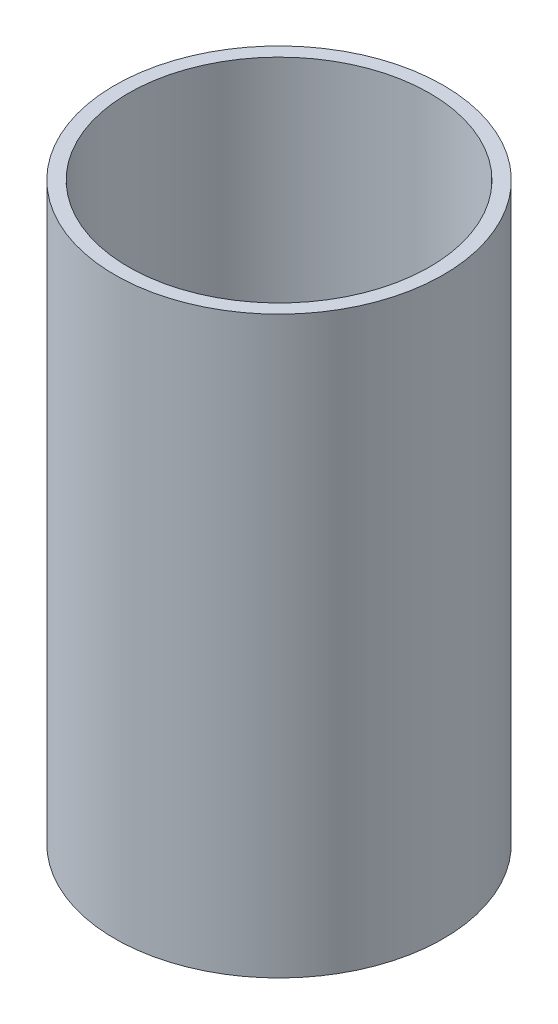
ISO-10303-21;
HEADER;
FILE_DESCRIPTION(('STEP AP214'),'2;1');
FILE_NAME('part.step','',(''),(''),'','','');
FILE_SCHEMA(('AUTOMOTIVE_DESIGN { 1 0 10303 214 1 1 1 1 }'));
ENDSEC;
DATA;
#1=APPLICATION_CONTEXT('core data for automotive mechanical design processes');
#2=APPLICATION_PROTOCOL_DEFINITION('international standard','automotive_design',2000,#1);
#3=PRODUCT_CONTEXT('',#1,'mechanical');
#4=PRODUCT('Part','Part','',(#3));
#5=PRODUCT_RELATED_PRODUCT_CATEGORY('part','',(#4));
#6=PRODUCT_DEFINITION_FORMATION('','',#4);
#7=PRODUCT_DEFINITION_CONTEXT('part definition',#1,'design');
#8=PRODUCT_DEFINITION('design','',#6,#7);
#9=PRODUCT_DEFINITION_SHAPE('','',#8);
#10=(LENGTH_UNIT() NAMED_UNIT(*) SI_UNIT(.MILLI.,.METRE.));
#11=(NAMED_UNIT(*) PLANE_ANGLE_UNIT() SI_UNIT($,.RADIAN.));
#12=(NAMED_UNIT(*) SI_UNIT($,.STERADIAN.) SOLID_ANGLE_UNIT());
#13=UNCERTAINTY_MEASURE_WITH_UNIT(LENGTH_MEASURE(1.E-05),#10,'distance_accuracy_value','');
#14=(GEOMETRIC_REPRESENTATION_CONTEXT(3) GLOBAL_UNCERTAINTY_ASSIGNED_CONTEXT((#13)) GLOBAL_UNIT_ASSIGNED_CONTEXT((#10,
#11,#12)) REPRESENTATION_CONTEXT('',''));
#15=CARTESIAN_POINT('',(0.,0.,0.));
#16=DIRECTION('',(0.,0.,1.));
#17=DIRECTION('',(1.,0.,0.));
#18=AXIS2_PLACEMENT_3D('',#15,#16,#17);
#19=CARTESIAN_POINT('',(0.,21.,0.));
#20=DIRECTION('',(0.,1.,0.));
#21=DIRECTION('',(0.,0.,1.));
#22=AXIS2_PLACEMENT_3D('',#19,#20,#21);
#23=PLANE('',#22);
#24=CARTESIAN_POINT('',(0.,21.,0.));
#25=DIRECTION('',(0.,1.,0.));
#26=DIRECTION('',(0.,0.,1.));
#27=AXIS2_PLACEMENT_3D('',#24,#25,#26);
#28=CIRCLE('',#27,12.);
#29=CARTESIAN_POINT('',(0.,21.,-12.));
#30=VERTEX_POINT('',#29);
#31=EDGE_CURVE('E10',#30,#30,#28,.T.);
#32=ORIENTED_EDGE('',*,*,#31,.T.);
#33=EDGE_LOOP('',(#32));
#34=FACE_BOUND('',#33,.T.);
#35=CARTESIAN_POINT('',(0.,21.,0.));
#36=DIRECTION('',(0.,1.,0.));
#37=DIRECTION('',(0.,0.,1.));
#38=AXIS2_PLACEMENT_3D('',#35,#36,#37);
#39=CIRCLE('',#38,11.);
#40=CARTESIAN_POINT('',(0.,21.,-11.));
#41=VERTEX_POINT('',#40);
#42=EDGE_CURVE('E46',#41,#41,#39,.T.);
#43=ORIENTED_EDGE('',*,*,#42,.F.);
#44=EDGE_LOOP('',(#43));
#45=FACE_BOUND('',#44,.T.);
#46=ADVANCED_FACE('F32',(#34,#45),#23,.T.);
#47=CARTESIAN_POINT('',(0.,-21.,0.));
#48=DIRECTION('',(0.,1.,0.));
#49=DIRECTION('',(0.,0.,1.));
#50=AXIS2_PLACEMENT_3D('',#47,#48,#49);
#51=PLANE('',#50);
#52=CARTESIAN_POINT('',(0.,-21.,0.));
#53=DIRECTION('',(0.,1.,0.));
#54=DIRECTION('',(0.,0.,1.));
#55=AXIS2_PLACEMENT_3D('',#52,#53,#54);
#56=CIRCLE('',#55,12.);
#57=CARTESIAN_POINT('',(0.,-21.,-12.));
#58=VERTEX_POINT('',#57);
#59=EDGE_CURVE('E36',#58,#58,#56,.T.);
#60=ORIENTED_EDGE('',*,*,#59,.F.);
#61=EDGE_LOOP('',(#60));
#62=FACE_BOUND('',#61,.T.);
#63=CARTESIAN_POINT('',(0.,-21.,0.));
#64=DIRECTION('',(0.,1.,0.));
#65=DIRECTION('',(0.,0.,1.));
#66=AXIS2_PLACEMENT_3D('',#63,#64,#65);
#67=CIRCLE('',#66,11.);
#68=CARTESIAN_POINT('',(0.,-21.,-11.));
#69=VERTEX_POINT('',#68);
#70=EDGE_CURVE('E48',#69,#69,#67,.T.);
#71=ORIENTED_EDGE('',*,*,#70,.T.);
#72=EDGE_LOOP('',(#71));
#73=FACE_BOUND('',#72,.T.);
#74=ADVANCED_FACE('F61',(#62,#73),#51,.F.);
#75=CARTESIAN_POINT('',(0.,21.,0.));
#76=DIRECTION('',(0.,-1.,0.));
#77=DIRECTION('',(0.,0.,-1.));
#78=AXIS2_PLACEMENT_3D('',#75,#76,#77);
#79=CYLINDRICAL_SURFACE('',#78,12.);
#80=CARTESIAN_POINT('',(0.,21.,-12.));
#81=CARTESIAN_POINT('',(0.,20.5625,-12.));
#82=CARTESIAN_POINT('',(0.,20.125,-12.));
#83=CARTESIAN_POINT('',(0.,19.25,-12.));
#84=CARTESIAN_POINT('',(0.,18.8125,-12.));
#85=CARTESIAN_POINT('',(0.,17.9375,-12.));
#86=CARTESIAN_POINT('',(0.,17.5,-12.));
#87=CARTESIAN_POINT('',(0.,16.625,-12.));
#88=CARTESIAN_POINT('',(0.,16.1875,-12.));
#89=CARTESIAN_POINT('',(0.,15.3125,-12.));
#90=CARTESIAN_POINT('',(0.,14.875,-12.));
#91=CARTESIAN_POINT('',(0.,14.,-12.));
#92=CARTESIAN_POINT('',(0.,13.5625,-12.));
#93=CARTESIAN_POINT('',(0.,12.6875,-12.));
#94=CARTESIAN_POINT('',(0.,12.25,-12.));
#95=CARTESIAN_POINT('',(0.,11.375,-12.));
#96=CARTESIAN_POINT('',(0.,10.9375,-12.));
#97=CARTESIAN_POINT('',(0.,10.0625,-12.));
#98=CARTESIAN_POINT('',(0.,9.625,-12.));
#99=CARTESIAN_POINT('',(0.,8.75,-12.));
#100=CARTESIAN_POINT('',(0.,8.3125,-12.));
#101=CARTESIAN_POINT('',(0.,7.4375,-12.));
#102=CARTESIAN_POINT('',(0.,7.,-12.));
#103=CARTESIAN_POINT('',(0.,6.125,-12.));
#104=CARTESIAN_POINT('',(0.,5.6875,-12.));
#105=CARTESIAN_POINT('',(0.,4.8125,-12.));
#106=CARTESIAN_POINT('',(0.,4.375,-12.));
#107=CARTESIAN_POINT('',(0.,3.5,-12.));
#108=CARTESIAN_POINT('',(0.,3.0625,-12.));
#109=CARTESIAN_POINT('',(0.,2.1875,-12.));
#110=CARTESIAN_POINT('',(0.,1.75,-12.));
#111=CARTESIAN_POINT('',(0.,0.874999999999997,-12.));
#112=CARTESIAN_POINT('',(0.,0.437499999999997,-12.));
#113=CARTESIAN_POINT('',(0.,-0.437500000000004,-12.));
#114=CARTESIAN_POINT('',(0.,-0.875000000000004,-12.));
#115=CARTESIAN_POINT('',(0.,-1.75000000000001,-12.));
#116=CARTESIAN_POINT('',(0.,-2.18750000000001,-12.));
#117=CARTESIAN_POINT('',(0.,-3.0625,-12.));
#118=CARTESIAN_POINT('',(0.,-3.5,-12.));
#119=CARTESIAN_POINT('',(0.,-4.375,-12.));
#120=CARTESIAN_POINT('',(0.,-4.8125,-12.));
#121=CARTESIAN_POINT('',(0.,-5.68750000000001,-12.));
#122=CARTESIAN_POINT('',(0.,-6.12500000000001,-12.));
#123=CARTESIAN_POINT('',(0.,-7.00000000000001,-12.));
#124=CARTESIAN_POINT('',(0.,-7.4375,-12.));
#125=CARTESIAN_POINT('',(0.,-8.3125,-12.));
#126=CARTESIAN_POINT('',(0.,-8.75,-12.));
#127=CARTESIAN_POINT('',(0.,-9.625,-12.));
#128=CARTESIAN_POINT('',(0.,-10.0625,-12.));
#129=CARTESIAN_POINT('',(0.,-10.9375,-12.));
#130=CARTESIAN_POINT('',(0.,-11.375,-12.));
#131=CARTESIAN_POINT('',(0.,-12.25,-12.));
#132=CARTESIAN_POINT('',(0.,-12.6875,-12.));
#133=CARTESIAN_POINT('',(0.,-13.5625,-12.));
#134=CARTESIAN_POINT('',(0.,-14.,-12.));
#135=CARTESIAN_POINT('',(0.,-14.875,-12.));
#136=CARTESIAN_POINT('',(0.,-15.3125,-12.));
#137=CARTESIAN_POINT('',(0.,-16.1875,-12.));
#138=CARTESIAN_POINT('',(0.,-16.625,-12.));
#139=CARTESIAN_POINT('',(0.,-17.5,-12.));
#140=CARTESIAN_POINT('',(0.,-17.9375,-12.));
#141=CARTESIAN_POINT('',(0.,-18.8125,-12.));
#142=CARTESIAN_POINT('',(0.,-19.25,-12.));
#143=CARTESIAN_POINT('',(0.,-20.125,-12.));
#144=CARTESIAN_POINT('',(0.,-20.5625,-12.));
#145=CARTESIAN_POINT('',(0.,-21.,-12.));
#146=B_SPLINE_CURVE_WITH_KNOTS('',3,(#80,#81,#82,#83,#84,#85,#86,#87,#88,#89,#90,#91,#92,#93,
#94,#95,#96,#97,#98,#99,#100,#101,#102,#103,#104,#105,#106,#107,#108,#109,#110,#111,#112,#113,
#114,#115,#116,#117,#118,#119,#120,#121,#122,#123,#124,#125,#126,#127,#128,#129,#130,#131,#132,
#133,#134,#135,#136,#137,#138,#139,#140,#141,#142,#143,#144,#145),.UNSPECIFIED.,.F.,.F.,(4,2,2,
2,2,2,2,2,2,2,2,2,2,2,2,2,2,2,2,2,2,2,2,2,2,2,2,2,2,2,2,2,4),(0.,1.3125,2.625,3.9375,5.25,
6.5625,7.875,9.1875,10.5,11.8125,13.125,14.4375,15.75,17.0625,18.375,19.6875,21.,22.3125,23.625,
24.9375,26.25,27.5625,28.875,30.1875,31.5,32.8125,34.125,35.4375,36.75,38.0625,39.375,40.6875,
42.),.UNSPECIFIED.);
#147=EDGE_CURVE('BSEAM34',#30,#58,#146,.T.);
#148=ORIENTED_EDGE('',*,*,#31,.F.);
#149=ORIENTED_EDGE('',*,*,#59,.T.);
#150=ORIENTED_EDGE('',*,*,#147,.T.);
#151=ORIENTED_EDGE('',*,*,#147,.F.);
#152=EDGE_LOOP('',(#148,#150,#149,#151));
#153=FACE_BOUND('',#152,.T.);
#154=ADVANCED_FACE('F34',(#153),#79,.T.);
#155=CARTESIAN_POINT('',(0.,21.,0.));
#156=DIRECTION('',(0.,-1.,0.));
#157=DIRECTION('',(0.,0.,-1.));
#158=AXIS2_PLACEMENT_3D('',#155,#156,#157);
#159=CYLINDRICAL_SURFACE('',#158,11.);
#160=CARTESIAN_POINT('',(0.,21.,-11.));
#161=CARTESIAN_POINT('',(0.,20.5625,-11.));
#162=CARTESIAN_POINT('',(0.,20.125,-11.));
#163=CARTESIAN_POINT('',(0.,19.25,-11.));
#164=CARTESIAN_POINT('',(0.,18.8125,-11.));
#165=CARTESIAN_POINT('',(0.,17.9375,-11.));
#166=CARTESIAN_POINT('',(0.,17.5,-11.));
#167=CARTESIAN_POINT('',(0.,16.625,-11.));
#168=CARTESIAN_POINT('',(0.,16.1875,-11.));
#169=CARTESIAN_POINT('',(0.,15.3125,-11.));
#170=CARTESIAN_POINT('',(0.,14.875,-11.));
#171=CARTESIAN_POINT('',(0.,14.,-11.));
#172=CARTESIAN_POINT('',(0.,13.5625,-11.));
#173=CARTESIAN_POINT('',(0.,12.6875,-11.));
#174=CARTESIAN_POINT('',(0.,12.25,-11.));
#175=CARTESIAN_POINT('',(0.,11.375,-11.));
#176=CARTESIAN_POINT('',(0.,10.9375,-11.));
#177=CARTESIAN_POINT('',(0.,10.0625,-11.));
#178=CARTESIAN_POINT('',(0.,9.625,-11.));
#179=CARTESIAN_POINT('',(0.,8.75,-11.));
#180=CARTESIAN_POINT('',(0.,8.3125,-11.));
#181=CARTESIAN_POINT('',(0.,7.4375,-11.));
#182=CARTESIAN_POINT('',(0.,7.,-11.));
#183=CARTESIAN_POINT('',(0.,6.125,-11.));
#184=CARTESIAN_POINT('',(0.,5.6875,-11.));
#185=CARTESIAN_POINT('',(0.,4.8125,-11.));
#186=CARTESIAN_POINT('',(0.,4.375,-11.));
#187=CARTESIAN_POINT('',(0.,3.5,-11.));
#188=CARTESIAN_POINT('',(0.,3.0625,-11.));
#189=CARTESIAN_POINT('',(0.,2.1875,-11.));
#190=CARTESIAN_POINT('',(0.,1.75,-11.));
#191=CARTESIAN_POINT('',(0.,0.875000000000001,-11.));
#192=CARTESIAN_POINT('',(0.,0.4375,-11.));
#193=CARTESIAN_POINT('',(0.,-0.4375,-11.));
#194=CARTESIAN_POINT('',(0.,-0.875000000000001,-11.));
#195=CARTESIAN_POINT('',(0.,-1.75,-11.));
#196=CARTESIAN_POINT('',(0.,-2.1875,-11.));
#197=CARTESIAN_POINT('',(0.,-3.0625,-11.));
#198=CARTESIAN_POINT('',(0.,-3.5,-11.));
#199=CARTESIAN_POINT('',(0.,-4.375,-11.));
#200=CARTESIAN_POINT('',(0.,-4.8125,-11.));
#201=CARTESIAN_POINT('',(0.,-5.6875,-11.));
#202=CARTESIAN_POINT('',(0.,-6.125,-11.));
#203=CARTESIAN_POINT('',(0.,-7.,-11.));
#204=CARTESIAN_POINT('',(0.,-7.4375,-11.));
#205=CARTESIAN_POINT('',(0.,-8.3125,-11.));
#206=CARTESIAN_POINT('',(0.,-8.75,-11.));
#207=CARTESIAN_POINT('',(0.,-9.625,-11.));
#208=CARTESIAN_POINT('',(0.,-10.0625,-11.));
#209=CARTESIAN_POINT('',(0.,-10.9375,-11.));
#210=CARTESIAN_POINT('',(0.,-11.375,-11.));
#211=CARTESIAN_POINT('',(0.,-12.25,-11.));
#212=CARTESIAN_POINT('',(0.,-12.6875,-11.));
#213=CARTESIAN_POINT('',(0.,-13.5625,-11.));
#214=CARTESIAN_POINT('',(0.,-14.,-11.));
#215=CARTESIAN_POINT('',(0.,-14.875,-11.));
#216=CARTESIAN_POINT('',(0.,-15.3125,-11.));
#217=CARTESIAN_POINT('',(0.,-16.1875,-11.));
#218=CARTESIAN_POINT('',(0.,-16.625,-11.));
#219=CARTESIAN_POINT('',(0.,-17.5,-11.));
#220=CARTESIAN_POINT('',(0.,-17.9375,-11.));
#221=CARTESIAN_POINT('',(0.,-18.8125,-11.));
#222=CARTESIAN_POINT('',(0.,-19.25,-11.));
#223=CARTESIAN_POINT('',(0.,-20.125,-11.));
#224=CARTESIAN_POINT('',(0.,-20.5625,-11.));
#225=CARTESIAN_POINT('',(0.,-21.,-11.));
#226=B_SPLINE_CURVE_WITH_KNOTS('',3,(#160,#161,#162,#163,#164,#165,#166,#167,#168,#169,#170,
#171,#172,#173,#174,#175,#176,#177,#178,#179,#180,#181,#182,#183,#184,#185,#186,#187,#188,#189,
#190,#191,#192,#193,#194,#195,#196,#197,#198,#199,#200,#201,#202,#203,#204,#205,#206,#207,#208,
#209,#210,#211,#212,#213,#214,#215,#216,#217,#218,#219,#220,#221,#222,#223,#224,#225),
.UNSPECIFIED.,.F.,.F.,(4,2,2,2,2,2,2,2,2,2,2,2,2,2,2,2,2,2,2,2,2,2,2,2,2,2,2,2,2,2,2,2,4),(0.,
1.3125,2.625,3.9375,5.25,6.5625,7.875,9.1875,10.5,11.8125,13.125,14.4375,15.75,17.0625,18.375,
19.6875,21.,22.3125,23.625,24.9375,26.25,27.5625,28.875,30.1875,31.5,32.8125,34.125,35.4375,
36.75,38.0625,39.375,40.6875,42.),.UNSPECIFIED.);
#227=EDGE_CURVE('BSEAM57',#41,#69,#226,.T.);
#228=ORIENTED_EDGE('',*,*,#42,.T.);
#229=ORIENTED_EDGE('',*,*,#70,.F.);
#230=ORIENTED_EDGE('',*,*,#227,.T.);
#231=ORIENTED_EDGE('',*,*,#227,.F.);
#232=EDGE_LOOP('',(#228,#230,#229,#231));
#233=FACE_BOUND('',#232,.T.);
#234=ADVANCED_FACE('F57',(#233),#159,.F.);
#235=CLOSED_SHELL('',(#46,#74,#154,#234));
#236=MANIFOLD_SOLID_BREP('B2',#235);
#237=ADVANCED_BREP_SHAPE_REPRESENTATION('',(#18,#236),#14);
#238=SHAPE_DEFINITION_REPRESENTATION(#9,#237);
ENDSEC;
END-ISO-10303-21;
